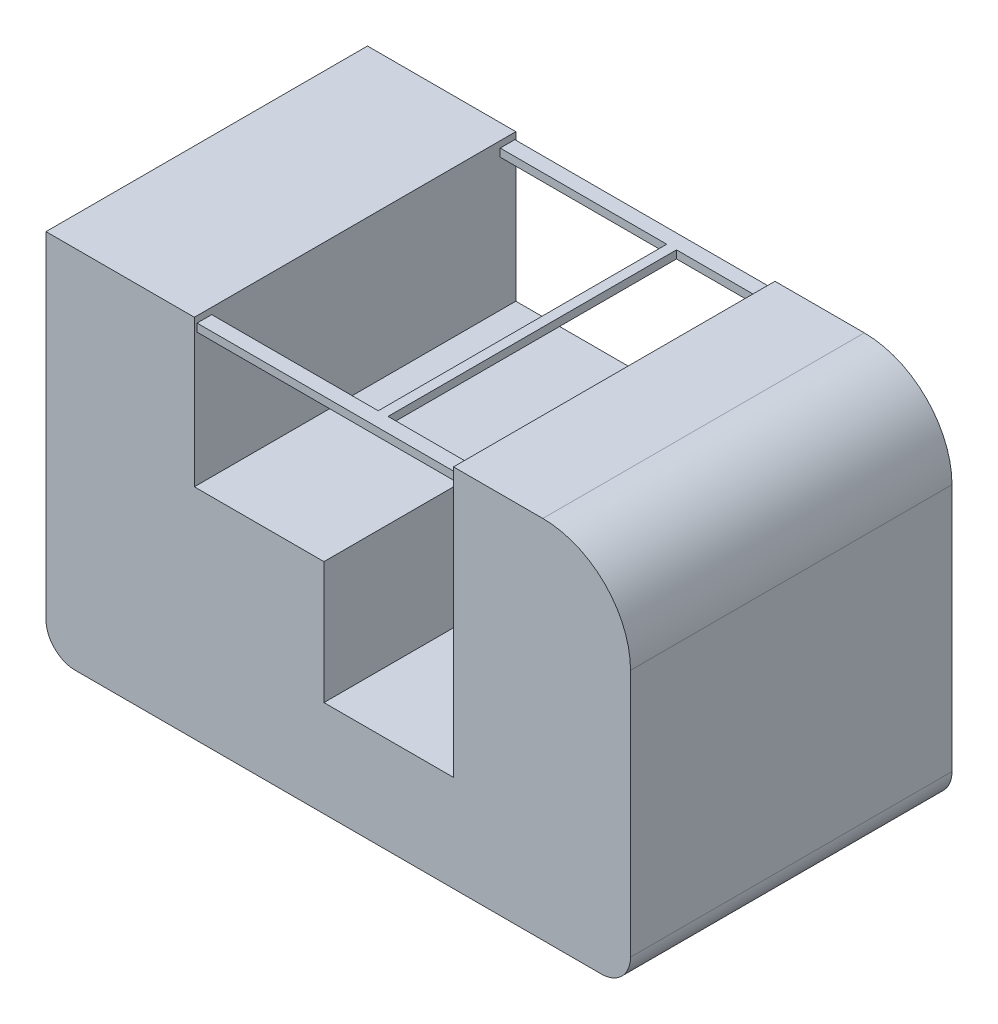
ISO-10303-21;
HEADER;
FILE_DESCRIPTION(('STEP AP214'),'2;1');
FILE_NAME('part.step','',(''),(''),'','','');
FILE_SCHEMA(('AUTOMOTIVE_DESIGN { 1 0 10303 214 1 1 1 1 }'));
ENDSEC;
DATA;
#1=APPLICATION_CONTEXT('core data for automotive mechanical design processes');
#2=APPLICATION_PROTOCOL_DEFINITION('international standard','automotive_design',2000,#1);
#3=PRODUCT_CONTEXT('',#1,'mechanical');
#4=PRODUCT('Part','Part','',(#3));
#5=PRODUCT_RELATED_PRODUCT_CATEGORY('part','',(#4));
#6=PRODUCT_DEFINITION_FORMATION('','',#4);
#7=PRODUCT_DEFINITION_CONTEXT('part definition',#1,'design');
#8=PRODUCT_DEFINITION('design','',#6,#7);
#9=PRODUCT_DEFINITION_SHAPE('','',#8);
#10=(LENGTH_UNIT() NAMED_UNIT(*) SI_UNIT(.MILLI.,.METRE.));
#11=(NAMED_UNIT(*) PLANE_ANGLE_UNIT() SI_UNIT($,.RADIAN.));
#12=(NAMED_UNIT(*) SI_UNIT($,.STERADIAN.) SOLID_ANGLE_UNIT());
#13=UNCERTAINTY_MEASURE_WITH_UNIT(LENGTH_MEASURE(1.E-05),#10,'distance_accuracy_value','');
#14=(GEOMETRIC_REPRESENTATION_CONTEXT(3) GLOBAL_UNCERTAINTY_ASSIGNED_CONTEXT((#13)) GLOBAL_UNIT_ASSIGNED_CONTEXT((#10,
#11,#12)) REPRESENTATION_CONTEXT('',''));
#15=CARTESIAN_POINT('',(0.,0.,0.));
#16=DIRECTION('',(0.,0.,1.));
#17=DIRECTION('',(1.,0.,0.));
#18=AXIS2_PLACEMENT_3D('',#15,#16,#17);
#19=CARTESIAN_POINT('',(2.54,2.54,27.94));
#20=DIRECTION('',(0.,0.,1.));
#21=DIRECTION('',(1.,0.,0.));
#22=AXIS2_PLACEMENT_3D('',#19,#20,#21);
#23=CYLINDRICAL_SURFACE('',#22,2.54);
#24=DIRECTION('',(0.,0.,1.));
#25=VECTOR('',#24,1.);
#26=CARTESIAN_POINT('',(0.,2.54,27.94));
#27=LINE('',#26,#25);
#28=CARTESIAN_POINT('',(0.,2.54,0.));
#29=VERTEX_POINT('',#28);
#30=CARTESIAN_POINT('',(0.,2.54,27.94));
#31=VERTEX_POINT('',#30);
#32=EDGE_CURVE('E388',#29,#31,#27,.T.);
#33=ORIENTED_EDGE('',*,*,#32,.F.);
#34=CARTESIAN_POINT('',(2.54,2.54,0.));
#35=DIRECTION('',(0.,0.,-1.));
#36=DIRECTION('',(-1.,0.,0.));
#37=AXIS2_PLACEMENT_3D('',#34,#35,#36);
#38=CIRCLE('',#37,2.54);
#39=CARTESIAN_POINT('',(2.54,0.,0.));
#40=VERTEX_POINT('',#39);
#41=EDGE_CURVE('E40',#40,#29,#38,.T.);
#42=ORIENTED_EDGE('',*,*,#41,.F.);
#43=DIRECTION('',(0.,0.,1.));
#44=VECTOR('',#43,1.);
#45=CARTESIAN_POINT('',(2.54,0.,27.94));
#46=LINE('',#45,#44);
#47=CARTESIAN_POINT('',(2.54,0.,27.94));
#48=VERTEX_POINT('',#47);
#49=EDGE_CURVE('E391',#48,#40,#46,.F.);
#50=ORIENTED_EDGE('',*,*,#49,.F.);
#51=CARTESIAN_POINT('',(2.54,2.54,27.94));
#52=DIRECTION('',(0.,0.,-1.));
#53=DIRECTION('',(-1.,0.,0.));
#54=AXIS2_PLACEMENT_3D('',#51,#52,#53);
#55=CIRCLE('',#54,2.54);
#56=EDGE_CURVE('E11',#31,#48,#55,.F.);
#57=ORIENTED_EDGE('',*,*,#56,.F.);
#58=EDGE_LOOP('',(#33,#42,#50,#57));
#59=FACE_BOUND('',#58,.T.);
#60=ADVANCED_FACE('F33',(#59),#23,.T.);
#61=CARTESIAN_POINT('',(48.26,2.54,27.94));
#62=DIRECTION('',(0.,0.,-1.));
#63=DIRECTION('',(-1.,0.,0.));
#64=AXIS2_PLACEMENT_3D('',#61,#62,#63);
#65=CYLINDRICAL_SURFACE('',#64,2.54);
#66=DIRECTION('',(0.,0.,-1.));
#67=VECTOR('',#66,1.);
#68=CARTESIAN_POINT('',(50.8,2.54,27.94));
#69=LINE('',#68,#67);
#70=CARTESIAN_POINT('',(50.8,2.54,27.94));
#71=VERTEX_POINT('',#70);
#72=CARTESIAN_POINT('',(50.8,2.54,0.));
#73=VERTEX_POINT('',#72);
#74=EDGE_CURVE('E377',#71,#73,#69,.T.);
#75=ORIENTED_EDGE('',*,*,#74,.F.);
#76=CARTESIAN_POINT('',(48.26,2.54,27.94));
#77=DIRECTION('',(0.,0.,-1.));
#78=DIRECTION('',(-1.,0.,0.));
#79=AXIS2_PLACEMENT_3D('',#76,#77,#78);
#80=CIRCLE('',#79,2.54);
#81=CARTESIAN_POINT('',(48.26,0.,27.94));
#82=VERTEX_POINT('',#81);
#83=EDGE_CURVE('E383',#82,#71,#80,.F.);
#84=ORIENTED_EDGE('',*,*,#83,.F.);
#85=DIRECTION('',(0.,0.,-1.));
#86=VECTOR('',#85,1.);
#87=CARTESIAN_POINT('',(48.26,0.,27.94));
#88=LINE('',#87,#86);
#89=CARTESIAN_POINT('',(48.26,0.,0.));
#90=VERTEX_POINT('',#89);
#91=EDGE_CURVE('E380',#90,#82,#88,.F.);
#92=ORIENTED_EDGE('',*,*,#91,.F.);
#93=CARTESIAN_POINT('',(48.26,2.54,0.));
#94=DIRECTION('',(0.,0.,-1.));
#95=DIRECTION('',(-1.,0.,0.));
#96=AXIS2_PLACEMENT_3D('',#93,#94,#95);
#97=CIRCLE('',#96,2.54);
#98=EDGE_CURVE('E385',#73,#90,#97,.T.);
#99=ORIENTED_EDGE('',*,*,#98,.F.);
#100=EDGE_LOOP('',(#75,#84,#92,#99));
#101=FACE_BOUND('',#100,.T.);
#102=ADVANCED_FACE('F443',(#101),#65,.T.);
#103=CARTESIAN_POINT('',(7.47568418177978,31.1947186456078,1.35921218067736));
#104=DIRECTION('',(0.,0.,-1.));
#105=DIRECTION('',(-1.,0.,0.));
#106=AXIS2_PLACEMENT_3D('',#103,#104,#105);
#107=PLANE('',#106);
#108=DIRECTION('',(0.,-1.,0.));
#109=VECTOR('',#108,1.);
#110=CARTESIAN_POINT('',(27.3678193181013,31.1947186456078,1.35921218067736));
#111=LINE('',#110,#109);
#112=CARTESIAN_POINT('',(27.3678193181013,31.1947186456078,1.35921218067736));
#113=VERTEX_POINT('',#112);
#114=CARTESIAN_POINT('',(27.3678193181013,30.5092301301784,1.35921218067736));
#115=VERTEX_POINT('',#114);
#116=EDGE_CURVE('E217',#113,#115,#111,.T.);
#117=ORIENTED_EDGE('',*,*,#116,.F.);
#118=DIRECTION('',(1.,0.,0.));
#119=VECTOR('',#118,1.);
#120=CARTESIAN_POINT('',(7.47568418177978,31.1947186456078,1.35921218067736));
#121=LINE('',#120,#119);
#122=CARTESIAN_POINT('',(12.893929481129,31.1947186456078,1.35921218067736));
#123=VERTEX_POINT('',#122);
#124=EDGE_CURVE('E286',#123,#113,#121,.T.);
#125=ORIENTED_EDGE('',*,*,#124,.F.);
#126=DIRECTION('',(0.,-1.,0.));
#127=VECTOR('',#126,1.);
#128=CARTESIAN_POINT('',(12.893929481129,31.75,1.35921218067736));
#129=LINE('',#128,#127);
#130=CARTESIAN_POINT('',(12.893929481129,30.5092301301784,1.35921218067736));
#131=VERTEX_POINT('',#130);
#132=EDGE_CURVE('E298',#123,#131,#129,.T.);
#133=ORIENTED_EDGE('',*,*,#132,.T.);
#134=DIRECTION('',(1.,0.,0.));
#135=VECTOR('',#134,1.);
#136=CARTESIAN_POINT('',(7.47568418177978,30.5092301301784,1.35921218067736));
#137=LINE('',#136,#135);
#138=EDGE_CURVE('E207',#131,#115,#137,.T.);
#139=ORIENTED_EDGE('',*,*,#138,.T.);
#140=EDGE_LOOP('',(#117,#125,#133,#139));
#141=FACE_BOUND('',#140,.T.);
#142=ADVANCED_FACE('F464',(#141),#107,.F.);
#143=DIRECTION('',(0.,1.,0.));
#144=VECTOR('',#143,1.);
#145=CARTESIAN_POINT('',(28.2169548285651,30.5092301301784,1.35921218067736));
#146=LINE('',#145,#144);
#147=CARTESIAN_POINT('',(28.2169548285651,30.5092301301784,1.35921218067736));
#148=VERTEX_POINT('',#147);
#149=CARTESIAN_POINT('',(28.2169548285651,31.1947186456078,1.35921218067736));
#150=VERTEX_POINT('',#149);
#151=EDGE_CURVE('E210',#148,#150,#146,.T.);
#152=ORIENTED_EDGE('',*,*,#151,.F.);
#153=CARTESIAN_POINT('',(35.4156841817798,30.5092301301784,1.35921218067736));
#154=VERTEX_POINT('',#153);
#155=EDGE_CURVE('E196',#148,#154,#137,.T.);
#156=ORIENTED_EDGE('',*,*,#155,.T.);
#157=DIRECTION('',(0.,1.,0.));
#158=VECTOR('',#157,1.);
#159=CARTESIAN_POINT('',(35.4156841817798,31.1947186456078,1.35921218067736));
#160=LINE('',#159,#158);
#161=CARTESIAN_POINT('',(35.4156841817798,31.1947186456078,1.35921218067736));
#162=VERTEX_POINT('',#161);
#163=EDGE_CURVE('E272',#154,#162,#160,.T.);
#164=ORIENTED_EDGE('',*,*,#163,.T.);
#165=EDGE_CURVE('E212',#150,#162,#121,.T.);
#166=ORIENTED_EDGE('',*,*,#165,.F.);
#167=EDGE_LOOP('',(#152,#156,#164,#166));
#168=FACE_BOUND('',#167,.T.);
#169=ADVANCED_FACE('F211',(#168),#107,.F.);
#170=CARTESIAN_POINT('',(7.47568418177978,31.1947186456078,26.4330734018098));
#171=DIRECTION('',(0.,0.,1.));
#172=DIRECTION('',(1.,0.,0.));
#173=AXIS2_PLACEMENT_3D('',#170,#171,#172);
#174=PLANE('',#173);
#175=DIRECTION('',(0.,1.,0.));
#176=VECTOR('',#175,1.);
#177=CARTESIAN_POINT('',(27.3678193181013,31.1947186456078,26.4330734018098));
#178=LINE('',#177,#176);
#179=CARTESIAN_POINT('',(27.3678193181013,30.5092301301784,26.4330734018098));
#180=VERTEX_POINT('',#179);
#181=CARTESIAN_POINT('',(27.3678193181013,31.1947186456078,26.4330734018098));
#182=VERTEX_POINT('',#181);
#183=EDGE_CURVE('E232',#180,#182,#178,.T.);
#184=ORIENTED_EDGE('',*,*,#183,.F.);
#185=DIRECTION('',(1.,0.,0.));
#186=VECTOR('',#185,1.);
#187=CARTESIAN_POINT('',(7.47568418177978,30.5092301301784,26.4330734018098));
#188=LINE('',#187,#186);
#189=CARTESIAN_POINT('',(12.893929481129,30.5092301301784,26.4330734018098));
#190=VERTEX_POINT('',#189);
#191=EDGE_CURVE('E251',#190,#180,#188,.T.);
#192=ORIENTED_EDGE('',*,*,#191,.F.);
#193=DIRECTION('',(0.,1.,0.));
#194=VECTOR('',#193,1.);
#195=CARTESIAN_POINT('',(12.893929481129,31.75,26.4330734018098));
#196=LINE('',#195,#194);
#197=CARTESIAN_POINT('',(12.893929481129,31.1947186456078,26.4330734018098));
#198=VERTEX_POINT('',#197);
#199=EDGE_CURVE('E263',#190,#198,#196,.T.);
#200=ORIENTED_EDGE('',*,*,#199,.T.);
#201=DIRECTION('',(1.,0.,0.));
#202=VECTOR('',#201,1.);
#203=CARTESIAN_POINT('',(7.47568418177978,31.1947186456078,26.4330734018098));
#204=LINE('',#203,#202);
#205=EDGE_CURVE('E255',#198,#182,#204,.T.);
#206=ORIENTED_EDGE('',*,*,#205,.T.);
#207=EDGE_LOOP('',(#184,#192,#200,#206));
#208=FACE_BOUND('',#207,.T.);
#209=ADVANCED_FACE('F614',(#208),#174,.F.);
#210=DIRECTION('',(0.,-1.,0.));
#211=VECTOR('',#210,1.);
#212=CARTESIAN_POINT('',(28.2169548285651,31.1947186456078,26.4330734018098));
#213=LINE('',#212,#211);
#214=CARTESIAN_POINT('',(28.2169548285651,31.1947186456078,26.4330734018098));
#215=VERTEX_POINT('',#214);
#216=CARTESIAN_POINT('',(28.2169548285651,30.5092301301784,26.4330734018098));
#217=VERTEX_POINT('',#216);
#218=EDGE_CURVE('E221',#215,#217,#213,.T.);
#219=ORIENTED_EDGE('',*,*,#218,.F.);
#220=CARTESIAN_POINT('',(35.4156841817798,31.1947186456078,26.4330734018098));
#221=VERTEX_POINT('',#220);
#222=EDGE_CURVE('E254',#215,#221,#204,.T.);
#223=ORIENTED_EDGE('',*,*,#222,.T.);
#224=DIRECTION('',(0.,-1.,0.));
#225=VECTOR('',#224,1.);
#226=CARTESIAN_POINT('',(35.4156841817798,31.1947186456078,26.4330734018098));
#227=LINE('',#226,#225);
#228=CARTESIAN_POINT('',(35.4156841817798,30.5092301301784,26.4330734018098));
#229=VERTEX_POINT('',#228);
#230=EDGE_CURVE('E241',#221,#229,#227,.T.);
#231=ORIENTED_EDGE('',*,*,#230,.T.);
#232=EDGE_CURVE('E250',#217,#229,#188,.T.);
#233=ORIENTED_EDGE('',*,*,#232,.F.);
#234=EDGE_LOOP('',(#219,#223,#231,#233));
#235=FACE_BOUND('',#234,.T.);
#236=ADVANCED_FACE('F566',(#235),#174,.F.);
#237=CARTESIAN_POINT('',(12.893929481129,31.75,0.));
#238=DIRECTION('',(-1.,0.,0.));
#239=DIRECTION('',(0.,0.,1.));
#240=AXIS2_PLACEMENT_3D('',#237,#238,#239);
#241=PLANE('',#240);
#242=ORIENTED_EDGE('',*,*,#132,.F.);
#243=DIRECTION('',(0.,0.,1.));
#244=VECTOR('',#243,1.);
#245=CARTESIAN_POINT('',(12.893929481129,31.1947186456078,0.));
#246=LINE('',#245,#244);
#247=CARTESIAN_POINT('',(12.893929481129,31.1947186456078,0.0892121806773604));
#248=VERTEX_POINT('',#247);
#249=EDGE_CURVE('E295',#248,#123,#246,.T.);
#250=ORIENTED_EDGE('',*,*,#249,.F.);
#251=DIRECTION('',(0.,1.,0.));
#252=VECTOR('',#251,1.);
#253=CARTESIAN_POINT('',(12.893929481129,31.75,0.0892121806773604));
#254=LINE('',#253,#252);
#255=CARTESIAN_POINT('',(12.893929481129,30.5092301301784,0.0892121806773604));
#256=VERTEX_POINT('',#255);
#257=EDGE_CURVE('E292',#256,#248,#254,.T.);
#258=ORIENTED_EDGE('',*,*,#257,.F.);
#259=DIRECTION('',(0.,0.,-1.));
#260=VECTOR('',#259,1.);
#261=CARTESIAN_POINT('',(12.893929481129,30.5092301301784,0.));
#262=LINE('',#261,#260);
#263=EDGE_CURVE('E289',#131,#256,#262,.T.);
#264=ORIENTED_EDGE('',*,*,#263,.F.);
#265=EDGE_LOOP('',(#242,#250,#258,#264));
#266=FACE_BOUND('',#265,.T.);
#267=DIRECTION('',(0.,-1.,0.));
#268=VECTOR('',#267,1.);
#269=CARTESIAN_POINT('',(12.893929481129,31.75,27.94));
#270=LINE('',#269,#268);
#271=CARTESIAN_POINT('',(12.893929481129,31.75,27.94));
#272=VERTEX_POINT('',#271);
#273=CARTESIAN_POINT('',(12.893929481129,18.9879829213641,27.94));
#274=VERTEX_POINT('',#273);
#275=EDGE_CURVE('E306',#272,#274,#270,.T.);
#276=ORIENTED_EDGE('',*,*,#275,.T.);
#277=DIRECTION('',(0.,0.,1.));
#278=VECTOR('',#277,1.);
#279=CARTESIAN_POINT('',(12.893929481129,18.9879829213641,0.));
#280=LINE('',#279,#278);
#281=CARTESIAN_POINT('',(12.893929481129,18.9879829213641,0.));
#282=VERTEX_POINT('',#281);
#283=EDGE_CURVE('E332',#282,#274,#280,.T.);
#284=ORIENTED_EDGE('',*,*,#283,.F.);
#285=DIRECTION('',(0.,-1.,0.));
#286=VECTOR('',#285,1.);
#287=CARTESIAN_POINT('',(12.893929481129,31.75,0.));
#288=LINE('',#287,#286);
#289=CARTESIAN_POINT('',(12.893929481129,31.75,0.));
#290=VERTEX_POINT('',#289);
#291=EDGE_CURVE('E315',#290,#282,#288,.T.);
#292=ORIENTED_EDGE('',*,*,#291,.F.);
#293=DIRECTION('',(0.,0.,1.));
#294=VECTOR('',#293,1.);
#295=CARTESIAN_POINT('',(12.893929481129,31.75,0.));
#296=LINE('',#295,#294);
#297=EDGE_CURVE('E335',#290,#272,#296,.T.);
#298=ORIENTED_EDGE('',*,*,#297,.T.);
#299=EDGE_LOOP('',(#276,#284,#292,#298));
#300=FACE_BOUND('',#299,.T.);
#301=DIRECTION('',(0.,-1.,0.));
#302=VECTOR('',#301,1.);
#303=CARTESIAN_POINT('',(12.893929481129,31.75,27.7030734018098));
#304=LINE('',#303,#302);
#305=CARTESIAN_POINT('',(12.893929481129,31.1947186456078,27.7030734018098));
#306=VERTEX_POINT('',#305);
#307=CARTESIAN_POINT('',(12.893929481129,30.5092301301784,27.7030734018098));
#308=VERTEX_POINT('',#307);
#309=EDGE_CURVE('E269',#306,#308,#304,.T.);
#310=ORIENTED_EDGE('',*,*,#309,.F.);
#311=DIRECTION('',(0.,0.,1.));
#312=VECTOR('',#311,1.);
#313=CARTESIAN_POINT('',(12.893929481129,31.1947186456078,0.));
#314=LINE('',#313,#312);
#315=EDGE_CURVE('E266',#198,#306,#314,.T.);
#316=ORIENTED_EDGE('',*,*,#315,.F.);
#317=ORIENTED_EDGE('',*,*,#199,.F.);
#318=DIRECTION('',(0.,0.,-1.));
#319=VECTOR('',#318,1.);
#320=CARTESIAN_POINT('',(12.893929481129,30.5092301301784,0.));
#321=LINE('',#320,#319);
#322=EDGE_CURVE('E260',#308,#190,#321,.T.);
#323=ORIENTED_EDGE('',*,*,#322,.F.);
#324=EDGE_LOOP('',(#310,#316,#317,#323));
#325=FACE_BOUND('',#324,.T.);
#326=ADVANCED_FACE('F407',(#266,#300,#325),#241,.F.);
#327=CARTESIAN_POINT('',(35.4156841817798,18.9879829213641,0.));
#328=DIRECTION('',(1.,0.,0.));
#329=DIRECTION('',(0.,0.,-1.));
#330=AXIS2_PLACEMENT_3D('',#327,#328,#329);
#331=PLANE('',#330);
#332=ORIENTED_EDGE('',*,*,#163,.F.);
#333=DIRECTION('',(0.,0.,1.));
#334=VECTOR('',#333,1.);
#335=CARTESIAN_POINT('',(35.4156841817798,30.5092301301784,0.0892121806773604));
#336=LINE('',#335,#334);
#337=CARTESIAN_POINT('',(35.4156841817798,30.5092301301784,0.0892121806773604));
#338=VERTEX_POINT('',#337);
#339=EDGE_CURVE('E203',#338,#154,#336,.T.);
#340=ORIENTED_EDGE('',*,*,#339,.F.);
#341=DIRECTION('',(0.,-1.,0.));
#342=VECTOR('',#341,1.);
#343=CARTESIAN_POINT('',(35.4156841817798,31.1947186456078,0.0892121806773604));
#344=LINE('',#343,#342);
#345=CARTESIAN_POINT('',(35.4156841817798,31.1947186456078,0.0892121806773604));
#346=VERTEX_POINT('',#345);
#347=EDGE_CURVE('E277',#346,#338,#344,.T.);
#348=ORIENTED_EDGE('',*,*,#347,.F.);
#349=DIRECTION('',(0.,0.,-1.));
#350=VECTOR('',#349,1.);
#351=CARTESIAN_POINT('',(35.4156841817798,31.1947186456078,0.0892121806773604));
#352=LINE('',#351,#350);
#353=EDGE_CURVE('E274',#162,#346,#352,.T.);
#354=ORIENTED_EDGE('',*,*,#353,.F.);
#355=EDGE_LOOP('',(#332,#340,#348,#354));
#356=FACE_BOUND('',#355,.T.);
#357=DIRECTION('',(0.,1.,0.));
#358=VECTOR('',#357,1.);
#359=CARTESIAN_POINT('',(35.4156841817798,18.9879829213641,27.94));
#360=LINE('',#359,#358);
#361=CARTESIAN_POINT('',(35.4156841817798,8.37677157201901,27.94));
#362=VERTEX_POINT('',#361);
#363=CARTESIAN_POINT('',(35.4156841817798,31.75,27.94));
#364=VERTEX_POINT('',#363);
#365=EDGE_CURVE('E327',#362,#364,#360,.T.);
#366=ORIENTED_EDGE('',*,*,#365,.T.);
#367=DIRECTION('',(0.,0.,1.));
#368=VECTOR('',#367,1.);
#369=CARTESIAN_POINT('',(35.4156841817798,31.75,0.));
#370=LINE('',#369,#368);
#371=CARTESIAN_POINT('',(35.4156841817798,31.75,0.));
#372=VERTEX_POINT('',#371);
#373=EDGE_CURVE('E337',#372,#364,#370,.T.);
#374=ORIENTED_EDGE('',*,*,#373,.F.);
#375=DIRECTION('',(0.,1.,0.));
#376=VECTOR('',#375,1.);
#377=CARTESIAN_POINT('',(35.4156841817798,8.37677157201901,0.));
#378=LINE('',#377,#376);
#379=CARTESIAN_POINT('',(35.4156841817798,8.37677157201901,0.));
#380=VERTEX_POINT('',#379);
#381=EDGE_CURVE('E312',#380,#372,#378,.T.);
#382=ORIENTED_EDGE('',*,*,#381,.F.);
#383=DIRECTION('',(0.,0.,1.));
#384=VECTOR('',#383,1.);
#385=CARTESIAN_POINT('',(35.4156841817798,8.37677157201901,0.));
#386=LINE('',#385,#384);
#387=EDGE_CURVE('E340',#380,#362,#386,.T.);
#388=ORIENTED_EDGE('',*,*,#387,.T.);
#389=EDGE_LOOP('',(#366,#374,#382,#388));
#390=FACE_BOUND('',#389,.T.);
#391=DIRECTION('',(0.,1.,0.));
#392=VECTOR('',#391,1.);
#393=CARTESIAN_POINT('',(35.4156841817798,31.1947186456078,27.7030734018098));
#394=LINE('',#393,#392);
#395=CARTESIAN_POINT('',(35.4156841817798,30.5092301301784,27.7030734018098));
#396=VERTEX_POINT('',#395);
#397=CARTESIAN_POINT('',(35.4156841817798,31.1947186456078,27.7030734018098));
#398=VERTEX_POINT('',#397);
#399=EDGE_CURVE('E235',#396,#398,#394,.T.);
#400=ORIENTED_EDGE('',*,*,#399,.F.);
#401=DIRECTION('',(0.,0.,1.));
#402=VECTOR('',#401,1.);
#403=CARTESIAN_POINT('',(35.4156841817798,30.5092301301784,26.4330734018098));
#404=LINE('',#403,#402);
#405=EDGE_CURVE('E244',#229,#396,#404,.T.);
#406=ORIENTED_EDGE('',*,*,#405,.F.);
#407=ORIENTED_EDGE('',*,*,#230,.F.);
#408=DIRECTION('',(0.,0.,-1.));
#409=VECTOR('',#408,1.);
#410=CARTESIAN_POINT('',(35.4156841817798,31.1947186456078,26.4330734018098));
#411=LINE('',#410,#409);
#412=EDGE_CURVE('E238',#398,#221,#411,.T.);
#413=ORIENTED_EDGE('',*,*,#412,.F.);
#414=EDGE_LOOP('',(#400,#406,#407,#413));
#415=FACE_BOUND('',#414,.T.);
#416=ADVANCED_FACE('F426',(#356,#390,#415),#331,.F.);
#417=CARTESIAN_POINT('',(43.18,24.13,27.94));
#418=DIRECTION('',(0.,0.,-1.));
#419=DIRECTION('',(-1.,0.,0.));
#420=AXIS2_PLACEMENT_3D('',#417,#418,#419);
#421=CYLINDRICAL_SURFACE('',#420,7.62);
#422=DIRECTION('',(0.,0.,-1.));
#423=VECTOR('',#422,1.);
#424=CARTESIAN_POINT('',(43.18,31.75,27.94));
#425=LINE('',#424,#423);
#426=CARTESIAN_POINT('',(43.18,31.75,27.94));
#427=VERTEX_POINT('',#426);
#428=CARTESIAN_POINT('',(43.18,31.75,0.));
#429=VERTEX_POINT('',#428);
#430=EDGE_CURVE('E366',#427,#429,#425,.T.);
#431=ORIENTED_EDGE('',*,*,#430,.F.);
#432=CARTESIAN_POINT('',(43.18,24.13,27.94));
#433=DIRECTION('',(0.,0.,-1.));
#434=DIRECTION('',(-1.,0.,0.));
#435=AXIS2_PLACEMENT_3D('',#432,#433,#434);
#436=CIRCLE('',#435,7.62);
#437=CARTESIAN_POINT('',(50.8,24.13,27.94));
#438=VERTEX_POINT('',#437);
#439=EDGE_CURVE('E372',#438,#427,#436,.F.);
#440=ORIENTED_EDGE('',*,*,#439,.F.);
#441=DIRECTION('',(0.,0.,-1.));
#442=VECTOR('',#441,1.);
#443=CARTESIAN_POINT('',(50.8,24.13,27.94));
#444=LINE('',#443,#442);
#445=CARTESIAN_POINT('',(50.8,24.13,0.));
#446=VERTEX_POINT('',#445);
#447=EDGE_CURVE('E369',#446,#438,#444,.F.);
#448=ORIENTED_EDGE('',*,*,#447,.F.);
#449=CARTESIAN_POINT('',(43.18,24.13,0.));
#450=DIRECTION('',(0.,0.,-1.));
#451=DIRECTION('',(-1.,0.,0.));
#452=AXIS2_PLACEMENT_3D('',#449,#450,#451);
#453=CIRCLE('',#452,7.62);
#454=EDGE_CURVE('E374',#429,#446,#453,.T.);
#455=ORIENTED_EDGE('',*,*,#454,.F.);
#456=EDGE_LOOP('',(#431,#440,#448,#455));
#457=FACE_BOUND('',#456,.T.);
#458=ADVANCED_FACE('F436',(#457),#421,.T.);
#459=CARTESIAN_POINT('',(0.,31.75,27.94));
#460=DIRECTION('',(0.,-1.,0.));
#461=DIRECTION('',(0.,0.,-1.));
#462=AXIS2_PLACEMENT_3D('',#459,#460,#461);
#463=PLANE('',#462);
#464=DIRECTION('',(-1.,0.,0.));
#465=VECTOR('',#464,1.);
#466=CARTESIAN_POINT('',(0.,31.75,27.94));
#467=LINE('',#466,#465);
#468=CARTESIAN_POINT('',(0.,31.75,27.94));
#469=VERTEX_POINT('',#468);
#470=EDGE_CURVE('E352',#272,#469,#467,.T.);
#471=ORIENTED_EDGE('',*,*,#470,.F.);
#472=ORIENTED_EDGE('',*,*,#297,.F.);
#473=DIRECTION('',(-1.,0.,0.));
#474=VECTOR('',#473,1.);
#475=CARTESIAN_POINT('',(0.,31.75,0.));
#476=LINE('',#475,#474);
#477=CARTESIAN_POINT('',(0.,31.75,0.));
#478=VERTEX_POINT('',#477);
#479=EDGE_CURVE('E362',#290,#478,#476,.T.);
#480=ORIENTED_EDGE('',*,*,#479,.T.);
#481=DIRECTION('',(0.,0.,-1.));
#482=VECTOR('',#481,1.);
#483=CARTESIAN_POINT('',(0.,31.75,27.94));
#484=LINE('',#483,#482);
#485=EDGE_CURVE('E355',#469,#478,#484,.T.);
#486=ORIENTED_EDGE('',*,*,#485,.F.);
#487=EDGE_LOOP('',(#471,#472,#480,#486));
#488=FACE_BOUND('',#487,.T.);
#489=ADVANCED_FACE('F403',(#488),#463,.F.);
#490=CARTESIAN_POINT('',(0.,0.,27.94));
#491=DIRECTION('',(1.,0.,0.));
#492=DIRECTION('',(0.,0.,-1.));
#493=AXIS2_PLACEMENT_3D('',#490,#491,#492);
#494=PLANE('',#493);
#495=DIRECTION('',(0.,-1.,0.));
#496=VECTOR('',#495,1.);
#497=CARTESIAN_POINT('',(0.,0.,0.));
#498=LINE('',#497,#496);
#499=EDGE_CURVE('E334',#478,#29,#498,.T.);
#500=ORIENTED_EDGE('',*,*,#499,.T.);
#501=ORIENTED_EDGE('',*,*,#32,.T.);
#502=DIRECTION('',(0.,-1.,0.));
#503=VECTOR('',#502,1.);
#504=CARTESIAN_POINT('',(0.,0.,27.94));
#505=LINE('',#504,#503);
#506=EDGE_CURVE('E345',#469,#31,#505,.T.);
#507=ORIENTED_EDGE('',*,*,#506,.F.);
#508=ORIENTED_EDGE('',*,*,#485,.T.);
#509=EDGE_LOOP('',(#500,#501,#507,#508));
#510=FACE_BOUND('',#509,.T.);
#511=ADVANCED_FACE('F399',(#510),#494,.F.);
#512=CARTESIAN_POINT('',(0.,0.,27.94));
#513=DIRECTION('',(0.,1.,0.));
#514=DIRECTION('',(0.,0.,1.));
#515=AXIS2_PLACEMENT_3D('',#512,#513,#514);
#516=PLANE('',#515);
#517=DIRECTION('',(1.,0.,0.));
#518=VECTOR('',#517,1.);
#519=CARTESIAN_POINT('',(0.,0.,27.94));
#520=LINE('',#519,#518);
#521=EDGE_CURVE('E347',#48,#82,#520,.T.);
#522=ORIENTED_EDGE('',*,*,#521,.F.);
#523=ORIENTED_EDGE('',*,*,#49,.T.);
#524=DIRECTION('',(1.,0.,0.));
#525=VECTOR('',#524,1.);
#526=CARTESIAN_POINT('',(0.,0.,0.));
#527=LINE('',#526,#525);
#528=EDGE_CURVE('E358',#40,#90,#527,.T.);
#529=ORIENTED_EDGE('',*,*,#528,.T.);
#530=ORIENTED_EDGE('',*,*,#91,.T.);
#531=EDGE_LOOP('',(#522,#523,#529,#530));
#532=FACE_BOUND('',#531,.T.);
#533=ADVANCED_FACE('F447',(#532),#516,.F.);
#534=CARTESIAN_POINT('',(50.8,0.,27.94));
#535=DIRECTION('',(-1.,0.,0.));
#536=DIRECTION('',(0.,0.,1.));
#537=AXIS2_PLACEMENT_3D('',#534,#535,#536);
#538=PLANE('',#537);
#539=DIRECTION('',(0.,1.,0.));
#540=VECTOR('',#539,1.);
#541=CARTESIAN_POINT('',(50.8,0.,27.94));
#542=LINE('',#541,#540);
#543=EDGE_CURVE('E350',#71,#438,#542,.T.);
#544=ORIENTED_EDGE('',*,*,#543,.F.);
#545=ORIENTED_EDGE('',*,*,#74,.T.);
#546=DIRECTION('',(0.,1.,0.));
#547=VECTOR('',#546,1.);
#548=CARTESIAN_POINT('',(50.8,0.,0.));
#549=LINE('',#548,#547);
#550=EDGE_CURVE('E360',#73,#446,#549,.T.);
#551=ORIENTED_EDGE('',*,*,#550,.T.);
#552=ORIENTED_EDGE('',*,*,#447,.T.);
#553=EDGE_LOOP('',(#544,#545,#551,#552));
#554=FACE_BOUND('',#553,.T.);
#555=ADVANCED_FACE('F439',(#554),#538,.F.);
#556=EDGE_CURVE('E353',#427,#364,#467,.T.);
#557=ORIENTED_EDGE('',*,*,#556,.F.);
#558=ORIENTED_EDGE('',*,*,#430,.T.);
#559=EDGE_CURVE('E348',#429,#372,#476,.T.);
#560=ORIENTED_EDGE('',*,*,#559,.T.);
#561=ORIENTED_EDGE('',*,*,#373,.T.);
#562=EDGE_LOOP('',(#557,#558,#560,#561));
#563=FACE_BOUND('',#562,.T.);
#564=ADVANCED_FACE('F430',(#563),#463,.F.);
#565=CARTESIAN_POINT('',(0.,0.,27.94));
#566=DIRECTION('',(0.,0.,-1.));
#567=DIRECTION('',(-1.,0.,0.));
#568=AXIS2_PLACEMENT_3D('',#565,#566,#567);
#569=PLANE('',#568);
#570=ORIENTED_EDGE('',*,*,#506,.T.);
#571=ORIENTED_EDGE('',*,*,#56,.T.);
#572=ORIENTED_EDGE('',*,*,#521,.T.);
#573=ORIENTED_EDGE('',*,*,#83,.T.);
#574=ORIENTED_EDGE('',*,*,#543,.T.);
#575=ORIENTED_EDGE('',*,*,#439,.T.);
#576=ORIENTED_EDGE('',*,*,#556,.T.);
#577=ORIENTED_EDGE('',*,*,#365,.F.);
#578=DIRECTION('',(1.,0.,0.));
#579=VECTOR('',#578,1.);
#580=CARTESIAN_POINT('',(24.1548068314544,8.37677157201901,27.94));
#581=LINE('',#580,#579);
#582=CARTESIAN_POINT('',(24.1548068314544,8.37677157201901,27.94));
#583=VERTEX_POINT('',#582);
#584=EDGE_CURVE('E324',#583,#362,#581,.T.);
#585=ORIENTED_EDGE('',*,*,#584,.F.);
#586=DIRECTION('',(0.,-1.,0.));
#587=VECTOR('',#586,1.);
#588=CARTESIAN_POINT('',(24.1548068314544,18.9879829213641,27.94));
#589=LINE('',#588,#587);
#590=CARTESIAN_POINT('',(24.1548068314544,18.9879829213641,27.94));
#591=VERTEX_POINT('',#590);
#592=EDGE_CURVE('E321',#591,#583,#589,.T.);
#593=ORIENTED_EDGE('',*,*,#592,.F.);
#594=DIRECTION('',(1.,0.,0.));
#595=VECTOR('',#594,1.);
#596=CARTESIAN_POINT('',(12.893929481129,18.9879829213641,27.94));
#597=LINE('',#596,#595);
#598=EDGE_CURVE('E301',#274,#591,#597,.T.);
#599=ORIENTED_EDGE('',*,*,#598,.F.);
#600=ORIENTED_EDGE('',*,*,#275,.F.);
#601=ORIENTED_EDGE('',*,*,#470,.T.);
#602=EDGE_LOOP('',(#570,#571,#572,#573,#574,#575,#576,#577,#585,#593,#599,#600,#601));
#603=FACE_BOUND('',#602,.T.);
#604=ADVANCED_FACE('F448',(#603),#569,.F.);
#605=CARTESIAN_POINT('',(0.,0.,0.));
#606=DIRECTION('',(0.,0.,-1.));
#607=DIRECTION('',(-1.,0.,0.));
#608=AXIS2_PLACEMENT_3D('',#605,#606,#607);
#609=PLANE('',#608);
#610=ORIENTED_EDGE('',*,*,#528,.F.);
#611=ORIENTED_EDGE('',*,*,#41,.T.);
#612=ORIENTED_EDGE('',*,*,#499,.F.);
#613=ORIENTED_EDGE('',*,*,#479,.F.);
#614=ORIENTED_EDGE('',*,*,#291,.T.);
#615=DIRECTION('',(1.,0.,0.));
#616=VECTOR('',#615,1.);
#617=CARTESIAN_POINT('',(12.893929481129,18.9879829213641,0.));
#618=LINE('',#617,#616);
#619=CARTESIAN_POINT('',(24.1548068314544,18.9879829213641,0.));
#620=VERTEX_POINT('',#619);
#621=EDGE_CURVE('E302',#282,#620,#618,.T.);
#622=ORIENTED_EDGE('',*,*,#621,.T.);
#623=DIRECTION('',(0.,-1.,0.));
#624=VECTOR('',#623,1.);
#625=CARTESIAN_POINT('',(24.1548068314544,18.9879829213641,0.));
#626=LINE('',#625,#624);
#627=CARTESIAN_POINT('',(24.1548068314544,8.37677157201901,0.));
#628=VERTEX_POINT('',#627);
#629=EDGE_CURVE('E305',#620,#628,#626,.T.);
#630=ORIENTED_EDGE('',*,*,#629,.T.);
#631=DIRECTION('',(1.,0.,0.));
#632=VECTOR('',#631,1.);
#633=CARTESIAN_POINT('',(24.1548068314544,8.37677157201901,0.));
#634=LINE('',#633,#632);
#635=EDGE_CURVE('E309',#628,#380,#634,.T.);
#636=ORIENTED_EDGE('',*,*,#635,.T.);
#637=ORIENTED_EDGE('',*,*,#381,.T.);
#638=ORIENTED_EDGE('',*,*,#559,.F.);
#639=ORIENTED_EDGE('',*,*,#454,.T.);
#640=ORIENTED_EDGE('',*,*,#550,.F.);
#641=ORIENTED_EDGE('',*,*,#98,.T.);
#642=EDGE_LOOP('',(#610,#611,#612,#613,#614,#622,#630,#636,#637,#638,#639,#640,#641));
#643=FACE_BOUND('',#642,.T.);
#644=ADVANCED_FACE('F395',(#643),#609,.T.);
#645=CARTESIAN_POINT('',(12.893929481129,18.9879829213641,0.));
#646=DIRECTION('',(0.,-1.,0.));
#647=DIRECTION('',(0.,0.,-1.));
#648=AXIS2_PLACEMENT_3D('',#645,#646,#647);
#649=PLANE('',#648);
#650=ORIENTED_EDGE('',*,*,#598,.T.);
#651=DIRECTION('',(0.,0.,1.));
#652=VECTOR('',#651,1.);
#653=CARTESIAN_POINT('',(24.1548068314544,18.9879829213641,0.));
#654=LINE('',#653,#652);
#655=EDGE_CURVE('E318',#620,#591,#654,.T.);
#656=ORIENTED_EDGE('',*,*,#655,.F.);
#657=ORIENTED_EDGE('',*,*,#621,.F.);
#658=ORIENTED_EDGE('',*,*,#283,.T.);
#659=EDGE_LOOP('',(#650,#656,#657,#658));
#660=FACE_BOUND('',#659,.T.);
#661=ADVANCED_FACE('F412',(#660),#649,.F.);
#662=CARTESIAN_POINT('',(24.1548068314544,8.37677157201901,0.));
#663=DIRECTION('',(0.,-1.,0.));
#664=DIRECTION('',(0.,0.,-1.));
#665=AXIS2_PLACEMENT_3D('',#662,#663,#664);
#666=PLANE('',#665);
#667=ORIENTED_EDGE('',*,*,#584,.T.);
#668=ORIENTED_EDGE('',*,*,#387,.F.);
#669=ORIENTED_EDGE('',*,*,#635,.F.);
#670=DIRECTION('',(0.,0.,1.));
#671=VECTOR('',#670,1.);
#672=CARTESIAN_POINT('',(24.1548068314544,8.37677157201901,0.));
#673=LINE('',#672,#671);
#674=EDGE_CURVE('E342',#628,#583,#673,.T.);
#675=ORIENTED_EDGE('',*,*,#674,.T.);
#676=EDGE_LOOP('',(#667,#668,#669,#675));
#677=FACE_BOUND('',#676,.T.);
#678=ADVANCED_FACE('F421',(#677),#666,.F.);
#679=CARTESIAN_POINT('',(24.1548068314544,18.9879829213641,0.));
#680=DIRECTION('',(-1.,0.,0.));
#681=DIRECTION('',(0.,0.,1.));
#682=AXIS2_PLACEMENT_3D('',#679,#680,#681);
#683=PLANE('',#682);
#684=ORIENTED_EDGE('',*,*,#592,.T.);
#685=ORIENTED_EDGE('',*,*,#674,.F.);
#686=ORIENTED_EDGE('',*,*,#629,.F.);
#687=ORIENTED_EDGE('',*,*,#655,.T.);
#688=EDGE_LOOP('',(#684,#685,#686,#687));
#689=FACE_BOUND('',#688,.T.);
#690=ADVANCED_FACE('F417',(#689),#683,.F.);
#691=CARTESIAN_POINT('',(7.47568418177978,31.1947186456078,0.0892121806773604));
#692=DIRECTION('',(0.,-1.,0.));
#693=DIRECTION('',(0.,0.,-1.));
#694=AXIS2_PLACEMENT_3D('',#691,#692,#693);
#695=PLANE('',#694);
#696=DIRECTION('',(1.,0.,0.));
#697=VECTOR('',#696,1.);
#698=CARTESIAN_POINT('',(7.47568418177978,31.1947186456078,0.0892121806773604));
#699=LINE('',#698,#697);
#700=EDGE_CURVE('E283',#248,#346,#699,.T.);
#701=ORIENTED_EDGE('',*,*,#700,.F.);
#702=ORIENTED_EDGE('',*,*,#249,.T.);
#703=ORIENTED_EDGE('',*,*,#124,.T.);
#704=DIRECTION('',(0.,0.,-1.));
#705=VECTOR('',#704,1.);
#706=CARTESIAN_POINT('',(27.3678193181013,31.1947186456078,26.7592121806774));
#707=LINE('',#706,#705);
#708=EDGE_CURVE('E225',#182,#113,#707,.T.);
#709=ORIENTED_EDGE('',*,*,#708,.F.);
#710=ORIENTED_EDGE('',*,*,#205,.F.);
#711=ORIENTED_EDGE('',*,*,#315,.T.);
#712=DIRECTION('',(1.,0.,0.));
#713=VECTOR('',#712,1.);
#714=CARTESIAN_POINT('',(7.47568418177978,31.1947186456078,27.7030734018098));
#715=LINE('',#714,#713);
#716=EDGE_CURVE('E257',#306,#398,#715,.T.);
#717=ORIENTED_EDGE('',*,*,#716,.T.);
#718=ORIENTED_EDGE('',*,*,#412,.T.);
#719=ORIENTED_EDGE('',*,*,#222,.F.);
#720=DIRECTION('',(0.,0.,-1.));
#721=VECTOR('',#720,1.);
#722=CARTESIAN_POINT('',(28.2169548285651,31.1947186456078,26.7592121806774));
#723=LINE('',#722,#721);
#724=EDGE_CURVE('E216',#215,#150,#723,.T.);
#725=ORIENTED_EDGE('',*,*,#724,.T.);
#726=ORIENTED_EDGE('',*,*,#165,.T.);
#727=ORIENTED_EDGE('',*,*,#353,.T.);
#728=EDGE_LOOP('',(#701,#702,#703,#709,#710,#711,#717,#718,#719,#725,#726,#727));
#729=FACE_BOUND('',#728,.T.);
#730=ADVANCED_FACE('F543',(#729),#695,.F.);
#731=CARTESIAN_POINT('',(7.47568418177978,31.1947186456078,0.0892121806773604));
#732=DIRECTION('',(0.,0.,1.));
#733=DIRECTION('',(1.,0.,0.));
#734=AXIS2_PLACEMENT_3D('',#731,#732,#733);
#735=PLANE('',#734);
#736=DIRECTION('',(1.,0.,0.));
#737=VECTOR('',#736,1.);
#738=CARTESIAN_POINT('',(7.47568418177978,30.5092301301784,0.0892121806773604));
#739=LINE('',#738,#737);
#740=EDGE_CURVE('E281',#256,#338,#739,.T.);
#741=ORIENTED_EDGE('',*,*,#740,.F.);
#742=ORIENTED_EDGE('',*,*,#257,.T.);
#743=ORIENTED_EDGE('',*,*,#700,.T.);
#744=ORIENTED_EDGE('',*,*,#347,.T.);
#745=EDGE_LOOP('',(#741,#742,#743,#744));
#746=FACE_BOUND('',#745,.T.);
#747=ADVANCED_FACE('F575',(#746),#735,.F.);
#748=CARTESIAN_POINT('',(7.47568418177978,30.5092301301784,0.0892121806773604));
#749=DIRECTION('',(0.,1.,0.));
#750=DIRECTION('',(0.,0.,1.));
#751=AXIS2_PLACEMENT_3D('',#748,#749,#750);
#752=PLANE('',#751);
#753=ORIENTED_EDGE('',*,*,#138,.F.);
#754=ORIENTED_EDGE('',*,*,#263,.T.);
#755=ORIENTED_EDGE('',*,*,#740,.T.);
#756=ORIENTED_EDGE('',*,*,#339,.T.);
#757=ORIENTED_EDGE('',*,*,#155,.F.);
#758=DIRECTION('',(0.,0.,-1.));
#759=VECTOR('',#758,1.);
#760=CARTESIAN_POINT('',(28.2169548285651,30.5092301301784,26.7592121806774));
#761=LINE('',#760,#759);
#762=EDGE_CURVE('E201',#217,#148,#761,.T.);
#763=ORIENTED_EDGE('',*,*,#762,.F.);
#764=ORIENTED_EDGE('',*,*,#232,.T.);
#765=ORIENTED_EDGE('',*,*,#405,.T.);
#766=DIRECTION('',(1.,0.,0.));
#767=VECTOR('',#766,1.);
#768=CARTESIAN_POINT('',(7.47568418177978,30.5092301301784,27.7030734018098));
#769=LINE('',#768,#767);
#770=EDGE_CURVE('E247',#308,#396,#769,.T.);
#771=ORIENTED_EDGE('',*,*,#770,.F.);
#772=ORIENTED_EDGE('',*,*,#322,.T.);
#773=ORIENTED_EDGE('',*,*,#191,.T.);
#774=DIRECTION('',(0.,0.,-1.));
#775=VECTOR('',#774,1.);
#776=CARTESIAN_POINT('',(27.3678193181013,30.5092301301784,26.7592121806774));
#777=LINE('',#776,#775);
#778=EDGE_CURVE('E222',#180,#115,#777,.T.);
#779=ORIENTED_EDGE('',*,*,#778,.T.);
#780=EDGE_LOOP('',(#753,#754,#755,#756,#757,#763,#764,#765,#771,#772,#773,#779));
#781=FACE_BOUND('',#780,.T.);
#782=ADVANCED_FACE('F199',(#781),#752,.F.);
#783=CARTESIAN_POINT('',(7.47568418177978,31.1947186456078,27.7030734018098));
#784=DIRECTION('',(0.,0.,-1.));
#785=DIRECTION('',(-1.,0.,0.));
#786=AXIS2_PLACEMENT_3D('',#783,#784,#785);
#787=PLANE('',#786);
#788=ORIENTED_EDGE('',*,*,#716,.F.);
#789=ORIENTED_EDGE('',*,*,#309,.T.);
#790=ORIENTED_EDGE('',*,*,#770,.T.);
#791=ORIENTED_EDGE('',*,*,#399,.T.);
#792=EDGE_LOOP('',(#788,#789,#790,#791));
#793=FACE_BOUND('',#792,.T.);
#794=ADVANCED_FACE('F594',(#793),#787,.F.);
#795=CARTESIAN_POINT('',(27.3678193181013,31.1947186456078,26.7592121806774));
#796=DIRECTION('',(1.,0.,0.));
#797=DIRECTION('',(0.,0.,-1.));
#798=AXIS2_PLACEMENT_3D('',#795,#796,#797);
#799=PLANE('',#798);
#800=ORIENTED_EDGE('',*,*,#778,.F.);
#801=ORIENTED_EDGE('',*,*,#183,.T.);
#802=ORIENTED_EDGE('',*,*,#708,.T.);
#803=ORIENTED_EDGE('',*,*,#116,.T.);
#804=EDGE_LOOP('',(#800,#801,#802,#803));
#805=FACE_BOUND('',#804,.T.);
#806=ADVANCED_FACE('F604',(#805),#799,.F.);
#807=CARTESIAN_POINT('',(28.2169548285651,30.5092301301784,26.7592121806774));
#808=DIRECTION('',(-1.,0.,0.));
#809=DIRECTION('',(0.,0.,1.));
#810=AXIS2_PLACEMENT_3D('',#807,#808,#809);
#811=PLANE('',#810);
#812=ORIENTED_EDGE('',*,*,#724,.F.);
#813=ORIENTED_EDGE('',*,*,#218,.T.);
#814=ORIENTED_EDGE('',*,*,#762,.T.);
#815=ORIENTED_EDGE('',*,*,#151,.T.);
#816=EDGE_LOOP('',(#812,#813,#814,#815));
#817=FACE_BOUND('',#816,.T.);
#818=ADVANCED_FACE('F220',(#817),#811,.F.);
#819=CLOSED_SHELL('',(#60,#102,#142,#169,#209,#236,#326,#416,#458,#489,#511,#533,#555,#564,#604,
#644,#661,#678,#690,#730,#747,#782,#794,#806,#818));
#820=MANIFOLD_SOLID_BREP('B2',#819);
#821=ADVANCED_BREP_SHAPE_REPRESENTATION('',(#18,#820),#14);
#822=SHAPE_DEFINITION_REPRESENTATION(#9,#821);
ENDSEC;
END-ISO-10303-21;
